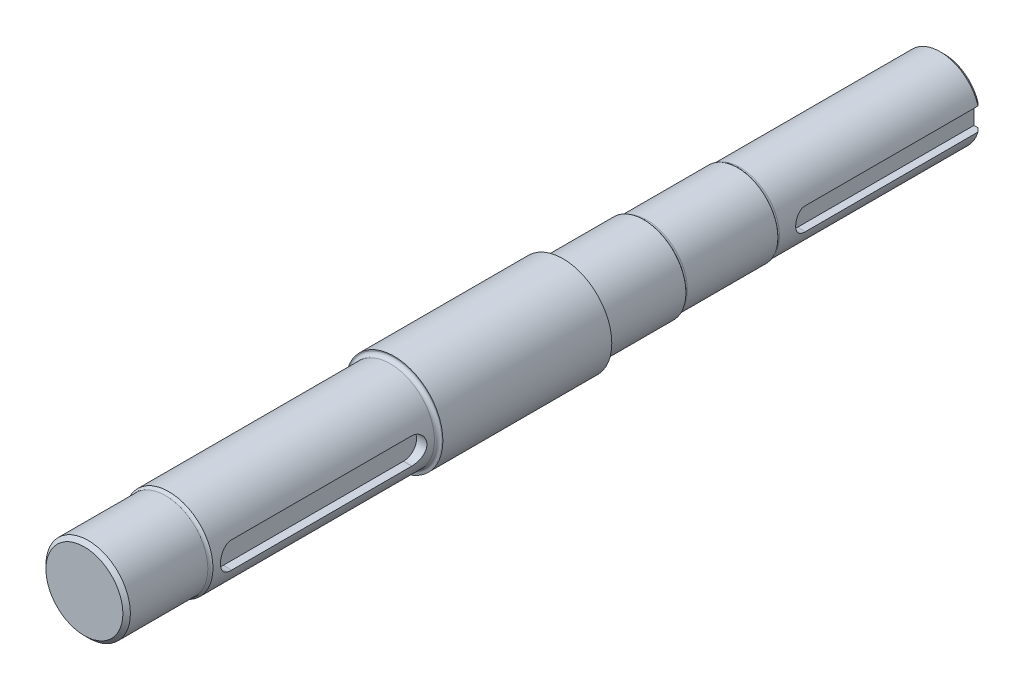
ISO-10303-21;
HEADER;
FILE_DESCRIPTION(('STEP AP214'),'2;1');
FILE_NAME('part.step','',(''),(''),'','','');
FILE_SCHEMA(('AUTOMOTIVE_DESIGN { 1 0 10303 214 1 1 1 1 }'));
ENDSEC;
DATA;
#1=APPLICATION_CONTEXT('core data for automotive mechanical design processes');
#2=APPLICATION_PROTOCOL_DEFINITION('international standard','automotive_design',2000,#1);
#3=PRODUCT_CONTEXT('',#1,'mechanical');
#4=PRODUCT('Part','Part','',(#3));
#5=PRODUCT_RELATED_PRODUCT_CATEGORY('part','',(#4));
#6=PRODUCT_DEFINITION_FORMATION('','',#4);
#7=PRODUCT_DEFINITION_CONTEXT('part definition',#1,'design');
#8=PRODUCT_DEFINITION('design','',#6,#7);
#9=PRODUCT_DEFINITION_SHAPE('','',#8);
#10=(LENGTH_UNIT() NAMED_UNIT(*) SI_UNIT(.MILLI.,.METRE.));
#11=(NAMED_UNIT(*) PLANE_ANGLE_UNIT() SI_UNIT($,.RADIAN.));
#12=(NAMED_UNIT(*) SI_UNIT($,.STERADIAN.) SOLID_ANGLE_UNIT());
#13=UNCERTAINTY_MEASURE_WITH_UNIT(LENGTH_MEASURE(1.E-05),#10,'distance_accuracy_value','');
#14=(GEOMETRIC_REPRESENTATION_CONTEXT(3) GLOBAL_UNCERTAINTY_ASSIGNED_CONTEXT((#13)) GLOBAL_UNIT_ASSIGNED_CONTEXT((#10,
#11,#12)) REPRESENTATION_CONTEXT('',''));
#15=CARTESIAN_POINT('',(0.,0.,0.));
#16=DIRECTION('',(0.,0.,1.));
#17=DIRECTION('',(1.,0.,0.));
#18=AXIS2_PLACEMENT_3D('',#15,#16,#17);
#19=CARTESIAN_POINT('',(0.,-21.,-293.));
#20=DIRECTION('',(0.,0.,-1.));
#21=DIRECTION('',(-1.,0.,0.));
#22=AXIS2_PLACEMENT_3D('',#19,#20,#21);
#23=PLANE('',#22);
#24=DIRECTION('',(0.,1.,0.));
#25=VECTOR('',#24,1.);
#26=CARTESIAN_POINT('',(16.,6.,-293.));
#27=LINE('',#26,#25);
#28=CARTESIAN_POINT('',(16.,-6.,-293.));
#29=VERTEX_POINT('',#28);
#30=CARTESIAN_POINT('',(16.,6.,-293.));
#31=VERTEX_POINT('',#30);
#32=EDGE_CURVE('E129',#29,#31,#27,.T.);
#33=ORIENTED_EDGE('',*,*,#32,.F.);
#34=DIRECTION('',(-1.,0.,0.));
#35=VECTOR('',#34,1.);
#36=CARTESIAN_POINT('',(63.,-6.,-293.));
#37=LINE('',#36,#35);
#38=CARTESIAN_POINT('',(18.0277563773198,-6.,-293.));
#39=VERTEX_POINT('',#38);
#40=EDGE_CURVE('E121',#39,#29,#37,.T.);
#41=ORIENTED_EDGE('',*,*,#40,.F.);
#42=CARTESIAN_POINT('',(0.,0.,-293.));
#43=DIRECTION('',(0.,0.,-1.));
#44=DIRECTION('',(-1.,0.,0.));
#45=AXIS2_PLACEMENT_3D('',#42,#43,#44);
#46=CIRCLE('',#45,18.9999999999999);
#47=CARTESIAN_POINT('',(18.0277563773198,6.,-293.));
#48=VERTEX_POINT('',#47);
#49=EDGE_CURVE('E210',#39,#48,#46,.T.);
#50=ORIENTED_EDGE('',*,*,#49,.T.);
#51=DIRECTION('',(-1.,0.,0.));
#52=VECTOR('',#51,1.);
#53=CARTESIAN_POINT('',(63.,6.,-293.));
#54=LINE('',#53,#52);
#55=EDGE_CURVE('E55',#48,#31,#54,.T.);
#56=ORIENTED_EDGE('',*,*,#55,.T.);
#57=EDGE_LOOP('',(#33,#41,#50,#56));
#58=FACE_BOUND('',#57,.T.);
#59=ADVANCED_FACE('F35',(#58),#23,.T.);
#60=CARTESIAN_POINT('',(0.,0.,440.995541917554));
#61=DIRECTION('',(0.,0.,1.));
#62=DIRECTION('',(1.,0.,0.));
#63=AXIS2_PLACEMENT_3D('',#60,#61,#62);
#64=CYLINDRICAL_SURFACE('',#63,21.);
#65=CARTESIAN_POINT('',(0.,0.,-184.322875655532));
#66=DIRECTION('',(0.,0.,1.));
#67=DIRECTION('',(1.,0.,0.));
#68=AXIS2_PLACEMENT_3D('',#65,#66,#67);
#69=CIRCLE('',#68,21.);
#70=CARTESIAN_POINT('',(21.,0.,-184.322875655532));
#71=VERTEX_POINT('',#70);
#72=EDGE_CURVE('E192',#71,#71,#69,.F.);
#73=ORIENTED_EDGE('',*,*,#72,.T.);
#74=EDGE_LOOP('',(#73));
#75=FACE_BOUND('',#74,.T.);
#76=CARTESIAN_POINT('',(0.,0.,-291.));
#77=DIRECTION('',(0.,0.,-1.));
#78=DIRECTION('',(-1.,0.,0.));
#79=AXIS2_PLACEMENT_3D('',#76,#77,#78);
#80=CIRCLE('',#79,21.);
#81=CARTESIAN_POINT('',(20.1246117974981,6.,-291.));
#82=VERTEX_POINT('',#81);
#83=CARTESIAN_POINT('',(20.1246117974981,-6.,-291.));
#84=VERTEX_POINT('',#83);
#85=EDGE_CURVE('E207',#82,#84,#80,.F.);
#86=ORIENTED_EDGE('',*,*,#85,.T.);
#87=DIRECTION('',(0.,0.,1.));
#88=VECTOR('',#87,1.);
#89=CARTESIAN_POINT('',(20.1246117974981,-5.99999999999999,440.995541917554));
#90=LINE('',#89,#88);
#91=CARTESIAN_POINT('',(20.1246117974981,-6.,-199.));
#92=VERTEX_POINT('',#91);
#93=EDGE_CURVE('E144',#84,#92,#90,.T.);
#94=ORIENTED_EDGE('',*,*,#93,.T.);
#95=CARTESIAN_POINT('',(20.1246117974981,-6.,-199.));
#96=CARTESIAN_POINT('',(20.1245894844569,-6.00002192169975,-198.834947668688));
#97=CARTESIAN_POINT('',(20.1266415650335,-5.9931904240759,-198.669903348075));
#98=CARTESIAN_POINT('',(20.1347317436705,-5.96598259693693,-198.341066478376));
#99=CARTESIAN_POINT('',(20.1407690151806,-5.94560907610498,-198.177273676843));
#100=CARTESIAN_POINT('',(20.1566481622527,-5.89154299099,-197.852490043676));
#101=CARTESIAN_POINT('',(20.1664810208216,-5.85788198887895,-197.691493509271));
#102=CARTESIAN_POINT('',(20.1896457121068,-5.77753958210296,-197.373039770528));
#103=CARTESIAN_POINT('',(20.2029776228772,-5.73085788698048,-197.21558264523));
#104=CARTESIAN_POINT('',(20.2327374247249,-5.62488729317033,-196.905364453882));
#105=CARTESIAN_POINT('',(20.2491637507907,-5.56560476546174,-196.752601059188));
#106=CARTESIAN_POINT('',(20.2846467474582,-5.43485915630499,-196.452631635706));
#107=CARTESIAN_POINT('',(20.3037043952519,-5.36339154736579,-196.305427697513));
#108=CARTESIAN_POINT('',(20.3439081708857,-5.2088169576332,-196.01756540388));
#109=CARTESIAN_POINT('',(20.3650542979004,-5.12570998143987,-195.876907045853));
#110=CARTESIAN_POINT('',(20.4088630364894,-4.94839867436059,-195.602944581921));
#111=CARTESIAN_POINT('',(20.4315262203764,-4.8541901450833,-195.469643286478));
#112=CARTESIAN_POINT('',(20.4783436926205,-4.65278362553808,-195.207961825265));
#113=CARTESIAN_POINT('',(20.5025212494045,-4.54531610125277,-195.07979320088));
#114=CARTESIAN_POINT('',(20.5511665277305,-4.32005021369054,-194.832853702692));
#115=CARTESIAN_POINT('',(20.5756343537369,-4.2022480271534,-194.714086338014));
#116=CARTESIAN_POINT('',(20.6241797197623,-3.95712206741071,-194.486784178728));
#117=CARTESIAN_POINT('',(20.6482573358332,-3.82980017742366,-194.378247369832));
#118=CARTESIAN_POINT('',(20.6953839164428,-3.56636964243007,-194.172060995003));
#119=CARTESIAN_POINT('',(20.7184324987362,-3.43025777747806,-194.074415454895));
#120=CARTESIAN_POINT('',(20.7632735217347,-3.14758929991082,-193.889054410551));
#121=CARTESIAN_POINT('',(20.7850352899035,-3.00088721837234,-193.801553110419));
#122=CARTESIAN_POINT('',(20.826226420028,-2.7002441525681,-193.639228116655));
#123=CARTESIAN_POINT('',(20.8456549445903,-2.54630059678401,-193.564408970666));
#124=CARTESIAN_POINT('',(20.8816082415408,-2.23235057760216,-193.428116616058));
#125=CARTESIAN_POINT('',(20.898134058101,-2.07234631966332,-193.366638606438));
#126=CARTESIAN_POINT('',(20.9278108104084,-1.74738349510969,-193.257524538967));
#127=CARTESIAN_POINT('',(20.9409618867737,-1.58242513524158,-193.209887904364));
#128=CARTESIAN_POINT('',(20.9632114411614,-1.25311298298007,-193.129934424879));
#129=CARTESIAN_POINT('',(20.9724060858907,-1.08885424992111,-193.097252652378));
#130=CARTESIAN_POINT('',(20.9869654862023,-0.758072191863194,-193.045729901245));
#131=CARTESIAN_POINT('',(20.9923316727767,-0.591549736734751,-193.026883751092));
#132=CARTESIAN_POINT('',(20.9990869856429,-0.257425560637054,-193.003185549667));
#133=CARTESIAN_POINT('',(21.0004759736798,-0.0898238023521121,-192.998333984873));
#134=CARTESIAN_POINT('',(20.999236691677,0.245181542828501,-193.002671725083));
#135=CARTESIAN_POINT('',(20.9966084880238,0.412585132953262,-193.011860798056));
#136=CARTESIAN_POINT('',(20.9875445764644,0.741067651658925,-193.0437217228));
#137=CARTESIAN_POINT('',(20.9812220240654,0.902188755140109,-193.065992978724));
#138=CARTESIAN_POINT('',(20.9650286514685,1.2219709065223,-193.123505519041));
#139=CARTESIAN_POINT('',(20.9551566896347,1.38063114576115,-193.158750976558));
#140=CARTESIAN_POINT('',(20.9321284663263,1.69432288207988,-193.241910347137));
#141=CARTESIAN_POINT('',(20.918972706835,1.84935492983109,-193.289822323978));
#142=CARTESIAN_POINT('',(20.8897205698511,2.15478873602949,-193.397935037923));
#143=CARTESIAN_POINT('',(20.8736241040379,2.30519035524902,-193.458136144122));
#144=CARTESIAN_POINT('',(20.8387145142278,2.60202980978099,-193.591101623643));
#145=CARTESIAN_POINT('',(20.8198732783987,2.74840530116376,-193.663997747168));
#146=CARTESIAN_POINT('',(20.7801082571492,3.0344604453685,-193.821323762295));
#147=CARTESIAN_POINT('',(20.7591851160121,3.17414215000025,-193.90575008866));
#148=CARTESIAN_POINT('',(20.7157807359019,3.44606990247429,-194.085614020909));
#149=CARTESIAN_POINT('',(20.6932987274225,3.57831221881557,-194.181057080676));
#150=CARTESIAN_POINT('',(20.6473712971919,3.83444718075925,-194.382259281203));
#151=CARTESIAN_POINT('',(20.6239261924859,3.95834253922789,-194.488015042589));
#152=CARTESIAN_POINT('',(20.5758300072593,4.20132091996745,-194.71312563803));
#153=CARTESIAN_POINT('',(20.551165615785,4.32007832115665,-194.83282935202));
#154=CARTESIAN_POINT('',(20.5021333353903,4.54708837545201,-195.081791573542));
#155=CARTESIAN_POINT('',(20.4777653468064,4.65534464996527,-195.211046759876));
#156=CARTESIAN_POINT('',(20.4299846752419,4.86074636422664,-195.47841209587));
#157=CARTESIAN_POINT('',(20.406572642352,4.95788432140758,-195.616528112395));
#158=CARTESIAN_POINT('',(20.3614014610979,5.14024855061122,-195.900593475688));
#159=CARTESIAN_POINT('',(20.3396416713267,5.22547945590107,-196.046539744782));
#160=CARTESIAN_POINT('',(20.2982196174412,5.38414968403492,-196.34669899954));
#161=CARTESIAN_POINT('',(20.2785778839985,5.45747656574094,-196.500974315305));
#162=CARTESIAN_POINT('',(20.242230137917,5.59078652189583,-196.815449833668));
#163=CARTESIAN_POINT('',(20.2255229337991,5.65077501464742,-196.975647599499));
#164=CARTESIAN_POINT('',(20.1955798271004,5.7568738046708,-197.300705203452));
#165=CARTESIAN_POINT('',(20.1823402998656,5.80299860073584,-197.465559972388));
#166=CARTESIAN_POINT('',(20.1597438752569,5.88101802101864,-197.798794657505));
#167=CARTESIAN_POINT('',(20.1503851792111,5.91291923804017,-197.967172902543));
#168=CARTESIAN_POINT('',(20.136996182678,5.95834488604588,-198.279598136448));
#169=CARTESIAN_POINT('',(20.1323602730056,5.97396720737165,-198.423317955371));
#170=CARTESIAN_POINT('',(20.1261641867038,5.99479248698429,-198.711354754082));
#171=CARTESIAN_POINT('',(20.1245993190641,6.00001133674436,-198.855670485138));
#172=CARTESIAN_POINT('',(20.1246117974981,6.,-199.));
#173=B_SPLINE_CURVE_WITH_KNOTS('',3,(#95,#96,#97,#98,#99,#100,#101,#102,#103,#104,#105,#106,
#107,#108,#109,#110,#111,#112,#113,#114,#115,#116,#117,#118,#119,#120,#121,#122,#123,#124,#125,
#126,#127,#128,#129,#130,#131,#132,#133,#134,#135,#136,#137,#138,#139,#140,#141,#142,#143,#144,
#145,#146,#147,#148,#149,#150,#151,#152,#153,#154,#155,#156,#157,#158,#159,#160,#161,#162,#163,
#164,#165,#166,#167,#168,#169,#170,#171,#172),.UNSPECIFIED.,.F.,.F.,(4,2,2,2,2,2,2,2,2,2,2,2,2,
2,2,2,2,2,2,2,2,2,2,2,2,2,2,2,2,2,2,2,2,2,2,2,2,2,4),(0.,0.49499061456547,0.989878597629598,
1.48359806377504,1.97732854438847,2.47080998622047,2.96447518729514,3.45814019326605,
3.95199249653474,4.4584116134109,4.9650188741466,5.47152618001261,5.97822009394079,
6.49417839820205,7.01032132824592,7.52627820764116,8.04221358474347,8.54478221320034,
9.04716289419293,9.54956103869483,10.0519508808723,10.5397044924402,11.027615126156,
11.5154512202231,12.0033019682409,12.4965554906444,12.9896568387743,13.4830033544228,
13.9761887449054,14.4868330315598,14.997300587207,15.5081096895234,16.0187194690592,
16.5339022452487,17.0488753606756,17.5633080229981,18.077501990939,18.5110248049339,
18.9438848967365),.UNSPECIFIED.);
#174=CARTESIAN_POINT('',(20.1246117974981,6.,-199.));
#175=VERTEX_POINT('',#174);
#176=EDGE_CURVE('E11',#92,#175,#173,.T.);
#177=ORIENTED_EDGE('',*,*,#176,.T.);
#178=DIRECTION('',(0.,0.,1.));
#179=VECTOR('',#178,1.);
#180=CARTESIAN_POINT('',(20.1246117974981,5.99999999999999,440.995541917554));
#181=LINE('',#180,#179);
#182=EDGE_CURVE('E120',#175,#82,#181,.F.);
#183=ORIENTED_EDGE('',*,*,#182,.T.);
#184=EDGE_LOOP('',(#86,#94,#177,#183));
#185=FACE_BOUND('',#184,.T.);
#186=ADVANCED_FACE('F287',(#75,#185),#64,.T.);
#187=CARTESIAN_POINT('',(0.,0.,-291.));
#188=DIRECTION('',(0.,0.,1.));
#189=DIRECTION('',(1.,0.,0.));
#190=AXIS2_PLACEMENT_3D('',#187,#188,#189);
#191=CONICAL_SURFACE('',#190,21.,0.785398163397444);
#192=ORIENTED_EDGE('',*,*,#49,.F.);
#193=CARTESIAN_POINT('',(10.4810452102635,-6.,-299.92306708226));
#194=CARTESIAN_POINT('',(10.6513032546173,-6.,-299.775303031963));
#195=CARTESIAN_POINT('',(10.821125289128,-6.,-299.627038165242));
#196=CARTESIAN_POINT('',(11.1599841790039,-6.,-299.329615943083));
#197=CARTESIAN_POINT('',(11.3290210395694,-6.,-299.180458593571));
#198=CARTESIAN_POINT('',(11.8350772315583,-6.,-298.731817684987));
#199=CARTESIAN_POINT('',(12.1710525240555,-6.,-298.431156260137));
#200=CARTESIAN_POINT('',(12.8407277429341,-6.,-297.827373841522));
#201=CARTESIAN_POINT('',(13.1744278699347,-6.,-297.524253069915));
#202=CARTESIAN_POINT('',(13.8399909256821,-6.,-296.91599688271));
#203=CARTESIAN_POINT('',(14.1718538383084,-6.,-296.610861449484));
#204=CARTESIAN_POINT('',(15.1650644146574,-6.,-295.693106940347));
#205=CARTESIAN_POINT('',(15.8241470780775,-6.,-295.078037143331));
#206=CARTESIAN_POINT('',(17.1380752900525,-6.,-293.843363920047));
#207=CARTESIAN_POINT('',(17.7929207242817,-6.,-293.223760372406));
#208=CARTESIAN_POINT('',(19.0993736402131,-6.,-291.981376778653));
#209=CARTESIAN_POINT('',(19.7509816622991,-6.,-291.358597300414));
#210=CARTESIAN_POINT('',(21.0518353563754,-6.,-290.110591789658));
#211=CARTESIAN_POINT('',(21.7010810535265,-6.,-289.485365783346));
#212=CARTESIAN_POINT('',(22.9978566697794,-6.,-288.232942009451));
#213=CARTESIAN_POINT('',(23.6453863145053,-6.,-287.605743957931));
#214=CARTESIAN_POINT('',(24.9389995977636,-6.,-286.349850216063));
#215=CARTESIAN_POINT('',(25.5850832274327,-6.,-285.721154516583));
#216=CARTESIAN_POINT('',(26.2306240877244,-6.,-285.091903820012));
#217=B_SPLINE_CURVE_WITH_KNOTS('',3,(#193,#194,#195,#196,#197,#198,#199,#200,#201,#202,#203,
#204,#205,#206,#207,#208,#209,#210,#211,#212,#213,#214,#215,#216),.UNSPECIFIED.,.F.,.F.,(4,2,2,
2,2,2,2,2,2,2,2,4),(0.,0.676309587890267,1.35261469009147,2.70518373594153,4.05763193130941,
5.41009197492979,8.11455401696938,10.8190887269061,13.5231557166413,16.2271938209176,
18.9316409276046,21.6361045655783),.UNSPECIFIED.);
#218=EDGE_CURVE('E48',#39,#84,#217,.T.);
#219=ORIENTED_EDGE('',*,*,#218,.T.);
#220=ORIENTED_EDGE('',*,*,#85,.F.);
#221=CARTESIAN_POINT('',(26.2306240877244,6.,-285.091903820012));
#222=CARTESIAN_POINT('',(25.5850832274327,6.,-285.721154516583));
#223=CARTESIAN_POINT('',(24.9389995977636,6.,-286.349850216062));
#224=CARTESIAN_POINT('',(23.6453863145054,6.,-287.605743957931));
#225=CARTESIAN_POINT('',(22.9978566697794,6.,-288.232942009451));
#226=CARTESIAN_POINT('',(21.7010810535266,6.,-289.485365783346));
#227=CARTESIAN_POINT('',(21.0518353563755,6.,-290.110591789658));
#228=CARTESIAN_POINT('',(19.7509816622991,6.,-291.358597300414));
#229=CARTESIAN_POINT('',(19.0993736402131,6.,-291.981376778653));
#230=CARTESIAN_POINT('',(17.7929207242817,6.,-293.223760372406));
#231=CARTESIAN_POINT('',(17.1380752900524,6.,-293.843363920047));
#232=CARTESIAN_POINT('',(15.8241470780775,6.,-295.078037143331));
#233=CARTESIAN_POINT('',(15.1650644146574,6.,-295.693106940347));
#234=CARTESIAN_POINT('',(14.1718538383084,6.,-296.610861449484));
#235=CARTESIAN_POINT('',(13.8399909256821,6.,-296.91599688271));
#236=CARTESIAN_POINT('',(13.1744278699347,6.,-297.524253069915));
#237=CARTESIAN_POINT('',(12.8407277429341,6.,-297.827373841522));
#238=CARTESIAN_POINT('',(12.1710525240555,6.,-298.431156260137));
#239=CARTESIAN_POINT('',(11.8350772315583,6.,-298.731817684987));
#240=CARTESIAN_POINT('',(11.3290210395694,6.,-299.180458593571));
#241=CARTESIAN_POINT('',(11.1599841790039,6.,-299.329615943083));
#242=CARTESIAN_POINT('',(10.821125289128,6.,-299.627038165242));
#243=CARTESIAN_POINT('',(10.6513032546173,6.,-299.775303031963));
#244=CARTESIAN_POINT('',(10.4810452102635,6.,-299.92306708226));
#245=B_SPLINE_CURVE_WITH_KNOTS('',3,(#221,#222,#223,#224,#225,#226,#227,#228,#229,#230,#231,
#232,#233,#234,#235,#236,#237,#238,#239,#240,#241,#242,#243,#244),.UNSPECIFIED.,.F.,.F.,(4,2,2,
2,2,2,2,2,2,2,2,4),(0.,2.70446363797367,5.40891074466061,8.1129488489369,10.8170158386722,
13.5215505486089,16.2260125906485,17.5784726342689,18.9309208296368,20.2834898754868,
20.959794977688,21.6361045655783),.UNSPECIFIED.);
#246=EDGE_CURVE('E260',#82,#48,#245,.T.);
#247=ORIENTED_EDGE('',*,*,#246,.T.);
#248=EDGE_LOOP('',(#192,#219,#220,#247));
#249=FACE_BOUND('',#248,.T.);
#250=ADVANCED_FACE('F269',(#249),#191,.T.);
#251=CARTESIAN_POINT('',(0.,0.,440.995541917554));
#252=DIRECTION('',(0.,0.,1.));
#253=DIRECTION('',(1.,0.,0.));
#254=AXIS2_PLACEMENT_3D('',#251,#252,#253);
#255=CYLINDRICAL_SURFACE('',#254,23.5);
#256=CARTESIAN_POINT('',(0.,0.,2.));
#257=DIRECTION('',(0.,0.,1.));
#258=DIRECTION('',(1.,0.,0.));
#259=AXIS2_PLACEMENT_3D('',#256,#257,#258);
#260=CIRCLE('',#259,23.5);
#261=CARTESIAN_POINT('',(23.5,0.,2.));
#262=VERTEX_POINT('',#261);
#263=EDGE_CURVE('E198',#262,#262,#260,.T.);
#264=ORIENTED_EDGE('',*,*,#263,.T.);
#265=EDGE_LOOP('',(#264));
#266=FACE_BOUND('',#265,.T.);
#267=CARTESIAN_POINT('',(0.,0.,120.));
#268=DIRECTION('',(0.,0.,1.));
#269=DIRECTION('',(1.,0.,0.));
#270=AXIS2_PLACEMENT_3D('',#267,#268,#269);
#271=CIRCLE('',#270,23.5);
#272=CARTESIAN_POINT('',(23.5,0.,120.));
#273=VERTEX_POINT('',#272);
#274=EDGE_CURVE('E165',#273,#273,#271,.T.);
#275=ORIENTED_EDGE('',*,*,#274,.F.);
#276=EDGE_LOOP('',(#275));
#277=FACE_BOUND('',#276,.T.);
#278=DIRECTION('',(0.,0.,1.));
#279=VECTOR('',#278,1.);
#280=CARTESIAN_POINT('',(22.4332342741746,-7.,440.995541917554));
#281=LINE('',#280,#279);
#282=CARTESIAN_POINT('',(22.4332342741746,-7.00000000000001,13.));
#283=VERTEX_POINT('',#282);
#284=CARTESIAN_POINT('',(22.4332342741746,-7.00000000000001,109.));
#285=VERTEX_POINT('',#284);
#286=EDGE_CURVE('E230',#283,#285,#281,.T.);
#287=ORIENTED_EDGE('',*,*,#286,.T.);
#288=CARTESIAN_POINT('',(22.4332342741746,-7.00000000000001,109.));
#289=CARTESIAN_POINT('',(22.4332069307169,-7.00002595583491,109.192180901223));
#290=CARTESIAN_POINT('',(22.4357029157213,-6.99208685935786,109.384351871376));
#291=CARTESIAN_POINT('',(22.4455419129914,-6.960470708831,109.767228500087));
#292=CARTESIAN_POINT('',(22.4528838484605,-6.93679715105623,109.957934474652));
#293=CARTESIAN_POINT('',(22.4721910804064,-6.87398280412955,110.336048332734));
#294=CARTESIAN_POINT('',(22.4841447548678,-6.83488089030004,110.52346327848));
#295=CARTESIAN_POINT('',(22.5123016503537,-6.74156234527354,110.894165880903));
#296=CARTESIAN_POINT('',(22.5285049800091,-6.68734532769801,111.077453431944));
#297=CARTESIAN_POINT('',(22.5646679867444,-6.56428671526882,111.438545705117));
#298=CARTESIAN_POINT('',(22.584625494707,-6.49545356249194,111.616353524668));
#299=CARTESIAN_POINT('',(22.6277307745088,-6.34366013699294,111.965506328238));
#300=CARTESIAN_POINT('',(22.6508797324378,-6.26069460931631,112.136848879171));
#301=CARTESIAN_POINT('',(22.6997112454859,-6.0812622028188,112.471940877477));
#302=CARTESIAN_POINT('',(22.7253939215543,-5.98479467937594,112.635689961822));
#303=CARTESIAN_POINT('',(22.7785991977061,-5.77898915929827,112.954658502078));
#304=CARTESIAN_POINT('',(22.8061224913256,-5.66964629935674,113.109874702244));
#305=CARTESIAN_POINT('',(22.8630462736462,-5.43562429231585,113.414970908873));
#306=CARTESIAN_POINT('',(22.892477655436,-5.31060388109982,113.564583485876));
#307=CARTESIAN_POINT('',(22.9516993255514,-5.04851948611336,113.852877056556));
#308=CARTESIAN_POINT('',(22.9814897352823,-4.91145132384677,113.991554225639));
#309=CARTESIAN_POINT('',(23.0406106861988,-4.62617274325894,114.257042124962));
#310=CARTESIAN_POINT('',(23.0699412248646,-4.47796226391248,114.383852790201));
#311=CARTESIAN_POINT('',(23.1273509031384,-4.1713267266614,114.624771100075));
#312=CARTESIAN_POINT('',(23.1554300525212,-4.0129017485676,114.738878843946));
#313=CARTESIAN_POINT('',(23.2101386876629,-3.68346406440145,114.955819500616));
#314=CARTESIAN_POINT('',(23.2367263407173,-3.5122591549721,115.058371398386));
#315=CARTESIAN_POINT('',(23.2870476552339,-3.16145444263298,115.248600074047));
#316=CARTESIAN_POINT('',(23.3107823701648,-2.98185777267424,115.336282347601));
#317=CARTESIAN_POINT('',(23.3547345238232,-2.61542130553665,115.496116762576));
#318=CARTESIAN_POINT('',(23.3749513065937,-2.42858016547201,115.568266008288));
#319=CARTESIAN_POINT('',(23.4112670053948,-2.04911746571587,115.696357014385));
#320=CARTESIAN_POINT('',(23.4273676966473,-1.85649843814554,115.75230576324));
#321=CARTESIAN_POINT('',(23.4546036771131,-1.47228355882099,115.846195680222));
#322=CARTESIAN_POINT('',(23.465864702882,-1.2808084638225,115.884594738055));
#323=CARTESIAN_POINT('',(23.4837367252216,-0.895179990168475,115.945266948019));
#324=CARTESIAN_POINT('',(23.4903495749751,-0.701027710395682,115.967546526936));
#325=CARTESIAN_POINT('',(23.4987441654192,-0.311429429331251,115.995795857339));
#326=CARTESIAN_POINT('',(23.5005257484417,-0.11598338602635,116.001765076538));
#327=CARTESIAN_POINT('',(23.499206245869,0.274704723791265,115.997335163728));
#328=CARTESIAN_POINT('',(23.4961052485049,0.469946793926098,115.9869363275));
#329=CARTESIAN_POINT('',(23.4852840759977,0.85258657104605,115.950457382846));
#330=CARTESIAN_POINT('',(23.477713121668,1.04003705103875,115.924883723493));
#331=CARTESIAN_POINT('',(23.4582753538161,1.41210198122514,115.858693974996));
#332=CARTESIAN_POINT('',(23.4464070764297,1.59671544263482,115.81807275986));
#333=CARTESIAN_POINT('',(23.4186929104574,1.96171163041693,115.722148684776));
#334=CARTESIAN_POINT('',(23.4028483586021,2.14209575635452,115.666850758436));
#335=CARTESIAN_POINT('',(23.3675856782696,2.49757018102708,115.541990977143));
#336=CARTESIAN_POINT('',(23.3481662067794,2.67265846135981,115.472423760428));
#337=CARTESIAN_POINT('',(23.3060217773072,3.01827708124261,115.318716027743));
#338=CARTESIAN_POINT('',(23.28326230223,3.18873461064117,115.234421327339));
#339=CARTESIAN_POINT('',(23.2351843297898,3.52201221452817,115.052395878672));
#340=CARTESIAN_POINT('',(23.2098649548458,3.68482964165056,114.954660518537));
#341=CARTESIAN_POINT('',(23.1573220866069,4.0017798775566,114.746451996927));
#342=CARTESIAN_POINT('',(23.1300985762022,4.15591260828072,114.635978720989));
#343=CARTESIAN_POINT('',(23.0744401369077,4.45458112384268,114.403015693776));
#344=CARTESIAN_POINT('',(23.0460051732359,4.59911663282995,114.280525597355));
#345=CARTESIAN_POINT('',(22.9875527117181,4.88305495655134,114.019400320763));
#346=CARTESIAN_POINT('',(22.9575162204135,5.02205172724791,113.880327534554));
#347=CARTESIAN_POINT('',(22.8977564416525,5.28784493023422,113.590999242367));
#348=CARTESIAN_POINT('',(22.8680330564681,5.41464527623986,113.44074735129));
#349=CARTESIAN_POINT('',(22.8097016890583,5.65533885267336,113.129868227673));
#350=CARTESIAN_POINT('',(22.7810944610193,5.7692234517333,112.969234168153));
#351=CARTESIAN_POINT('',(22.7258465233781,5.98315172281196,112.638766736357));
#352=CARTESIAN_POINT('',(22.6992050514635,6.08320077349977,112.468936974908));
#353=CARTESIAN_POINT('',(22.6483991436546,6.26972579754376,112.119326014389));
#354=CARTESIAN_POINT('',(22.6242630822926,6.356051174883,111.939460258847));
#355=CARTESIAN_POINT('',(22.5795424919012,6.51313534230193,111.572711581192));
#356=CARTESIAN_POINT('',(22.5589565127143,6.58390049177531,111.385831562471));
#357=CARTESIAN_POINT('',(22.5220018682464,6.70922522952223,111.006526415271));
#358=CARTESIAN_POINT('',(22.5056287693478,6.76380186384378,110.814107355222));
#359=CARTESIAN_POINT('',(22.4776144823811,6.85632392746287,110.425055104358));
#360=CARTESIAN_POINT('',(22.4659711104743,6.89427703291398,110.22842390265));
#361=CARTESIAN_POINT('',(22.4490644795625,6.94911799834859,109.859922179051));
#362=CARTESIAN_POINT('',(22.4431397743727,6.96819920411491,109.688404968865));
#363=CARTESIAN_POINT('',(22.4352190642659,6.99363836770037,109.344596250516));
#364=CARTESIAN_POINT('',(22.4332172477383,7.00001514687833,109.17230626732));
#365=CARTESIAN_POINT('',(22.4332342741746,7.00000000000001,109.));
#366=B_SPLINE_CURVE_WITH_KNOTS('',3,(#288,#289,#290,#291,#292,#293,#294,#295,#296,#297,#298,
#299,#300,#301,#302,#303,#304,#305,#306,#307,#308,#309,#310,#311,#312,#313,#314,#315,#316,#317,
#318,#319,#320,#321,#322,#323,#324,#325,#326,#327,#328,#329,#330,#331,#332,#333,#334,#335,#336,
#337,#338,#339,#340,#341,#342,#343,#344,#345,#346,#347,#348,#349,#350,#351,#352,#353,#354,#355,
#356,#357,#358,#359,#360,#361,#362,#363,#364,#365),.UNSPECIFIED.,.F.,.F.,(4,2,2,2,2,2,2,2,2,2,2,
2,2,2,2,2,2,2,2,2,2,2,2,2,2,2,2,2,2,2,2,2,2,2,2,2,2,2,4),(0.,0.57634728968532,1.15256655495234,
1.72734308025646,2.30213429958349,2.87659442616102,3.45126862701905,4.02597027375092,
4.60088969890842,5.19175588019153,5.78282780513534,6.37390296754926,6.96497351216596,
7.56823234490842,8.17126773101666,8.7744154394728,9.37730257686589,9.9634084693355,
10.5492805543014,11.135171758947,11.7210523763143,12.288399909978,12.8559408901842,
13.423291331361,13.9908553493059,14.5647625670998,15.1388672023383,15.7129769969046,
16.2871032858294,16.8831279279753,17.4789606689537,18.0751892769766,18.6711854412792,
19.2733271937836,19.8752223944156,20.4764815480634,21.0774627681914,21.5949893745609,
22.1117487035884),.UNSPECIFIED.);
#367=CARTESIAN_POINT('',(22.4332342741746,7.00000000000001,109.));
#368=VERTEX_POINT('',#367);
#369=EDGE_CURVE('E254',#285,#368,#366,.T.);
#370=ORIENTED_EDGE('',*,*,#369,.T.);
#371=DIRECTION('',(0.,0.,1.));
#372=VECTOR('',#371,1.);
#373=CARTESIAN_POINT('',(22.4332342741746,7.,440.995541917554));
#374=LINE('',#373,#372);
#375=CARTESIAN_POINT('',(22.4332342741746,7.,13.));
#376=VERTEX_POINT('',#375);
#377=EDGE_CURVE('E219',#368,#376,#374,.F.);
#378=ORIENTED_EDGE('',*,*,#377,.T.);
#379=CARTESIAN_POINT('',(22.4332342741746,7.00000000000001,13.));
#380=CARTESIAN_POINT('',(22.4332069307169,7.00002595583491,12.8078190987771));
#381=CARTESIAN_POINT('',(22.4357029157213,6.99208685935786,12.6156481286236));
#382=CARTESIAN_POINT('',(22.4455419129914,6.960470708831,12.2327714999132));
#383=CARTESIAN_POINT('',(22.4528838484605,6.93679715105623,12.0420655253477));
#384=CARTESIAN_POINT('',(22.4721910804064,6.87398280412955,11.6639516672663));
#385=CARTESIAN_POINT('',(22.4841447548678,6.83488089030004,11.4765367215198));
#386=CARTESIAN_POINT('',(22.5123016503537,6.74156234527354,11.1058341190968));
#387=CARTESIAN_POINT('',(22.5285049800091,6.68734532769801,10.922546568056));
#388=CARTESIAN_POINT('',(22.5646679867444,6.56428671526882,10.561454294883));
#389=CARTESIAN_POINT('',(22.584625494707,6.49545356249194,10.3836464753324));
#390=CARTESIAN_POINT('',(22.6277307745088,6.34366013699294,10.034493671762));
#391=CARTESIAN_POINT('',(22.6508797324378,6.2606946093163,9.86315112082938));
#392=CARTESIAN_POINT('',(22.6997112454859,6.0812622028188,9.52805912252264));
#393=CARTESIAN_POINT('',(22.7253939215543,5.98479467937594,9.36431003817847));
#394=CARTESIAN_POINT('',(22.7785991977061,5.77898915929826,9.04534149792197));
#395=CARTESIAN_POINT('',(22.8061224913256,5.66964629935674,8.89012529775549));
#396=CARTESIAN_POINT('',(22.8630462736462,5.43562429231586,8.58502909112725));
#397=CARTESIAN_POINT('',(22.892477655436,5.31060388109983,8.43541651412374));
#398=CARTESIAN_POINT('',(22.9516993255514,5.04851948611337,8.14712294344411));
#399=CARTESIAN_POINT('',(22.9814897352823,4.91145132384678,8.00844577436058));
#400=CARTESIAN_POINT('',(23.0406106861988,4.62617274325895,7.7429578750382));
#401=CARTESIAN_POINT('',(23.0699412248646,4.47796226391249,7.6161472097994));
#402=CARTESIAN_POINT('',(23.1273509031384,4.17132672666141,7.37522889992503));
#403=CARTESIAN_POINT('',(23.1554300525212,4.01290174856761,7.26112115605437));
#404=CARTESIAN_POINT('',(23.2101386876629,3.68346406440145,7.04418049938417));
#405=CARTESIAN_POINT('',(23.2367263407173,3.5122591549721,6.94162860161358));
#406=CARTESIAN_POINT('',(23.2870476552339,3.16145444263299,6.75139992595289));
#407=CARTESIAN_POINT('',(23.3107823701648,2.98185777267424,6.66371765239885));
#408=CARTESIAN_POINT('',(23.3547345238232,2.61542130553665,6.50388323742367));
#409=CARTESIAN_POINT('',(23.3749513065937,2.42858016547201,6.4317339917121));
#410=CARTESIAN_POINT('',(23.4112670053948,2.04911746571587,6.30364298561538));
#411=CARTESIAN_POINT('',(23.4273676966474,1.85649843814554,6.24769423676013));
#412=CARTESIAN_POINT('',(23.4546036771131,1.47228355882099,6.15380431977779));
#413=CARTESIAN_POINT('',(23.465864702882,1.2808084638225,6.1154052619454));
#414=CARTESIAN_POINT('',(23.4837367252216,0.895179990168472,6.05473305198059));
#415=CARTESIAN_POINT('',(23.4903495749751,0.70102771039568,6.03245347306363));
#416=CARTESIAN_POINT('',(23.4987441654192,0.311429429331249,6.0042041426606));
#417=CARTESIAN_POINT('',(23.5005257484417,0.115983386026348,5.99823492346234));
#418=CARTESIAN_POINT('',(23.499206245869,-0.274704723791268,6.00266483627211));
#419=CARTESIAN_POINT('',(23.4961052485049,-0.469946793926101,6.01306367249971));
#420=CARTESIAN_POINT('',(23.4852840759977,-0.852586571046055,6.04954261715371));
#421=CARTESIAN_POINT('',(23.477713121668,-1.04003705103876,6.07511627650715));
#422=CARTESIAN_POINT('',(23.4582753538161,-1.41210198122515,6.14130602500395));
#423=CARTESIAN_POINT('',(23.4464070764297,-1.59671544263482,6.18192724013985));
#424=CARTESIAN_POINT('',(23.4186929104574,-1.96171163041693,6.2778513152238));
#425=CARTESIAN_POINT('',(23.4028483586021,-2.14209575635452,6.33314924156359));
#426=CARTESIAN_POINT('',(23.3675856782696,-2.49757018102708,6.45800902285691));
#427=CARTESIAN_POINT('',(23.3481662067794,-2.67265846135981,6.52757623957204));
#428=CARTESIAN_POINT('',(23.3060217773072,-3.01827708124261,6.68128397225668));
#429=CARTESIAN_POINT('',(23.28326230223,-3.18873461064118,6.76557867266054));
#430=CARTESIAN_POINT('',(23.2351843297897,-3.52201221452818,6.94760412132833));
#431=CARTESIAN_POINT('',(23.2098649548458,-3.68482964165057,7.0453394814629));
#432=CARTESIAN_POINT('',(23.1573220866069,-4.00177987755662,7.25354800307259));
#433=CARTESIAN_POINT('',(23.1300985762022,-4.15591260828073,7.36402127901111));
#434=CARTESIAN_POINT('',(23.0744401369077,-4.45458112384269,7.5969843062241));
#435=CARTESIAN_POINT('',(23.0460051732359,-4.59911663282996,7.71947440264459));
#436=CARTESIAN_POINT('',(22.9875527117181,-4.88305495655135,7.98059967923665));
#437=CARTESIAN_POINT('',(22.9575162204135,-5.02205172724792,8.11967246544576));
#438=CARTESIAN_POINT('',(22.8977564416525,-5.28784493023423,8.40900075763258));
#439=CARTESIAN_POINT('',(22.8680330564681,-5.41464527623986,8.55925264870985));
#440=CARTESIAN_POINT('',(22.8097016890583,-5.65533885267337,8.87013177232733));
#441=CARTESIAN_POINT('',(22.7810944610193,-5.76922345173331,9.0307658318469));
#442=CARTESIAN_POINT('',(22.7258465233781,-5.98315172281197,9.36123326364317));
#443=CARTESIAN_POINT('',(22.6992050514635,-6.08320077349977,9.53106302509162));
#444=CARTESIAN_POINT('',(22.6483991436546,-6.26972579754377,9.88067398561137));
#445=CARTESIAN_POINT('',(22.6242630822926,-6.35605117488301,10.0605397411532));
#446=CARTESIAN_POINT('',(22.5795424919012,-6.51313534230194,10.427288418808));
#447=CARTESIAN_POINT('',(22.5589565127143,-6.58390049177532,10.6141684375291));
#448=CARTESIAN_POINT('',(22.5220018682464,-6.70922522952224,10.9934735847293));
#449=CARTESIAN_POINT('',(22.5056287693478,-6.76380186384378,11.1858926447778));
#450=CARTESIAN_POINT('',(22.4776144823811,-6.85632392746288,11.5749448956422));
#451=CARTESIAN_POINT('',(22.4659711104743,-6.89427703291398,11.7715760973501));
#452=CARTESIAN_POINT('',(22.4490644795625,-6.94911799834859,12.1400778209489));
#453=CARTESIAN_POINT('',(22.4431397743727,-6.96819920411491,12.3115950311348));
#454=CARTESIAN_POINT('',(22.4352190642659,-6.99363836770037,12.6554037494843));
#455=CARTESIAN_POINT('',(22.4332172477383,-7.00001514687833,12.82769373268));
#456=CARTESIAN_POINT('',(22.4332342741746,-7.00000000000001,13.));
#457=B_SPLINE_CURVE_WITH_KNOTS('',3,(#379,#380,#381,#382,#383,#384,#385,#386,#387,#388,#389,
#390,#391,#392,#393,#394,#395,#396,#397,#398,#399,#400,#401,#402,#403,#404,#405,#406,#407,#408,
#409,#410,#411,#412,#413,#414,#415,#416,#417,#418,#419,#420,#421,#422,#423,#424,#425,#426,#427,
#428,#429,#430,#431,#432,#433,#434,#435,#436,#437,#438,#439,#440,#441,#442,#443,#444,#445,#446,
#447,#448,#449,#450,#451,#452,#453,#454,#455,#456),.UNSPECIFIED.,.F.,.F.,(4,2,2,2,2,2,2,2,2,2,2,
2,2,2,2,2,2,2,2,2,2,2,2,2,2,2,2,2,2,2,2,2,2,2,2,2,2,2,4),(0.,0.576347289685333,1.15256655495234,
1.72734308025647,2.30213429958349,2.87659442616104,3.45126862701907,4.02597027375093,
4.60088969890842,5.19175588019152,5.78282780513533,6.37390296754925,6.96497351216595,
7.56823234490842,8.17126773101666,8.77441543947281,9.37730257686589,9.96340846933551,
10.5492805543014,11.135171758947,11.7210523763143,12.288399909978,12.8559408901842,
13.423291331361,13.9908553493059,14.5647625670998,15.1388672023384,15.7129769969046,
16.2871032858294,16.8831279279754,17.4789606689537,18.0751892769767,18.6711854412792,
19.2733271937836,19.8752223944157,20.4764815480634,21.0774627681914,21.5949893745609,
22.1117487035884),.UNSPECIFIED.);
#458=EDGE_CURVE('E222',#376,#283,#457,.T.);
#459=ORIENTED_EDGE('',*,*,#458,.T.);
#460=EDGE_LOOP('',(#287,#370,#378,#459));
#461=FACE_BOUND('',#460,.T.);
#462=ADVANCED_FACE('F232',(#266,#277,#461),#255,.T.);
#463=CARTESIAN_POINT('',(0.,0.,440.995541917554));
#464=DIRECTION('',(0.,0.,1.));
#465=DIRECTION('',(1.,0.,0.));
#466=AXIS2_PLACEMENT_3D('',#463,#464,#465);
#467=CYLINDRICAL_SURFACE('',#466,21.5);
#468=CARTESIAN_POINT('',(0.,0.,-134.732050807569));
#469=DIRECTION('',(0.,0.,1.));
#470=DIRECTION('',(1.,0.,0.));
#471=AXIS2_PLACEMENT_3D('',#468,#469,#470);
#472=CIRCLE('',#471,21.5);
#473=CARTESIAN_POINT('',(21.5,0.,-134.732050807569));
#474=VERTEX_POINT('',#473);
#475=EDGE_CURVE('E195',#474,#474,#472,.F.);
#476=ORIENTED_EDGE('',*,*,#475,.T.);
#477=EDGE_LOOP('',(#476));
#478=FACE_BOUND('',#477,.T.);
#479=CARTESIAN_POINT('',(0.,0.,-183.));
#480=DIRECTION('',(0.,0.,1.));
#481=DIRECTION('',(1.,0.,0.));
#482=AXIS2_PLACEMENT_3D('',#479,#480,#481);
#483=CIRCLE('',#482,21.5);
#484=CARTESIAN_POINT('',(21.5,0.,-183.));
#485=VERTEX_POINT('',#484);
#486=EDGE_CURVE('E189',#485,#485,#483,.T.);
#487=ORIENTED_EDGE('',*,*,#486,.T.);
#488=EDGE_LOOP('',(#487));
#489=FACE_BOUND('',#488,.T.);
#490=ADVANCED_FACE('F358',(#478,#489),#467,.T.);
#491=CARTESIAN_POINT('',(0.,0.,440.995541917554));
#492=DIRECTION('',(0.,0.,1.));
#493=DIRECTION('',(1.,0.,0.));
#494=AXIS2_PLACEMENT_3D('',#491,#492,#493);
#495=CYLINDRICAL_SURFACE('',#494,22.5);
#496=CARTESIAN_POINT('',(0.,0.,-133.));
#497=DIRECTION('',(0.,0.,1.));
#498=DIRECTION('',(1.,0.,0.));
#499=AXIS2_PLACEMENT_3D('',#496,#497,#498);
#500=CIRCLE('',#499,22.5);
#501=CARTESIAN_POINT('',(22.5,0.,-133.));
#502=VERTEX_POINT('',#501);
#503=EDGE_CURVE('E186',#502,#502,#500,.T.);
#504=ORIENTED_EDGE('',*,*,#503,.T.);
#505=EDGE_LOOP('',(#504));
#506=FACE_BOUND('',#505,.T.);
#507=CARTESIAN_POINT('',(0.,0.,-92.0000000000001));
#508=DIRECTION('',(0.,0.,1.));
#509=DIRECTION('',(1.,0.,0.));
#510=AXIS2_PLACEMENT_3D('',#507,#508,#509);
#511=CIRCLE('',#510,22.5);
#512=CARTESIAN_POINT('',(22.5,0.,-92.0000000000001));
#513=VERTEX_POINT('',#512);
#514=EDGE_CURVE('E183',#513,#513,#511,.T.);
#515=ORIENTED_EDGE('',*,*,#514,.F.);
#516=EDGE_LOOP('',(#515));
#517=FACE_BOUND('',#516,.T.);
#518=ADVANCED_FACE('F355',(#506,#517),#495,.T.);
#519=CARTESIAN_POINT('',(0.,0.,-91.7000000000001));
#520=DIRECTION('',(0.,0.,-1.));
#521=DIRECTION('',(-1.,0.,0.));
#522=AXIS2_PLACEMENT_3D('',#519,#520,#521);
#523=CONICAL_SURFACE('',#522,22.2,0.785398163397506);
#524=ORIENTED_EDGE('',*,*,#514,.T.);
#525=EDGE_LOOP('',(#524));
#526=FACE_BOUND('',#525,.T.);
#527=CARTESIAN_POINT('',(0.,0.,-91.7000000000001));
#528=DIRECTION('',(0.,0.,1.));
#529=DIRECTION('',(1.,0.,0.));
#530=AXIS2_PLACEMENT_3D('',#527,#528,#529);
#531=CIRCLE('',#530,22.2);
#532=CARTESIAN_POINT('',(22.2,0.,-91.7000000000001));
#533=VERTEX_POINT('',#532);
#534=EDGE_CURVE('E180',#533,#533,#531,.T.);
#535=ORIENTED_EDGE('',*,*,#534,.F.);
#536=EDGE_LOOP('',(#535));
#537=FACE_BOUND('',#536,.T.);
#538=ADVANCED_FACE('F351',(#526,#537),#523,.T.);
#539=CARTESIAN_POINT('',(0.,0.,440.995541917554));
#540=DIRECTION('',(0.,0.,1.));
#541=DIRECTION('',(1.,0.,0.));
#542=AXIS2_PLACEMENT_3D('',#539,#540,#541);
#543=CYLINDRICAL_SURFACE('',#542,22.2);
#544=ORIENTED_EDGE('',*,*,#534,.T.);
#545=EDGE_LOOP('',(#544));
#546=FACE_BOUND('',#545,.T.);
#547=CARTESIAN_POINT('',(0.,0.,-90.8000000000001));
#548=DIRECTION('',(0.,0.,1.));
#549=DIRECTION('',(1.,0.,0.));
#550=AXIS2_PLACEMENT_3D('',#547,#548,#549);
#551=CIRCLE('',#550,22.2);
#552=CARTESIAN_POINT('',(22.2,0.,-90.8000000000001));
#553=VERTEX_POINT('',#552);
#554=EDGE_CURVE('E177',#553,#553,#551,.T.);
#555=ORIENTED_EDGE('',*,*,#554,.F.);
#556=EDGE_LOOP('',(#555));
#557=FACE_BOUND('',#556,.T.);
#558=ADVANCED_FACE('F347',(#546,#557),#543,.T.);
#559=CARTESIAN_POINT('',(0.,0.,-90.8000000000001));
#560=DIRECTION('',(0.,0.,1.));
#561=DIRECTION('',(1.,0.,0.));
#562=AXIS2_PLACEMENT_3D('',#559,#560,#561);
#563=TOROIDAL_SURFACE('',#562,23.,0.79999999999999);
#564=ORIENTED_EDGE('',*,*,#554,.T.);
#565=EDGE_LOOP('',(#564));
#566=FACE_BOUND('',#565,.T.);
#567=CARTESIAN_POINT('',(0.,0.,-90.0000000000001));
#568=DIRECTION('',(0.,0.,1.));
#569=DIRECTION('',(1.,0.,0.));
#570=AXIS2_PLACEMENT_3D('',#567,#568,#569);
#571=CIRCLE('',#570,23.);
#572=CARTESIAN_POINT('',(23.,0.,-90.0000000000001));
#573=VERTEX_POINT('',#572);
#574=EDGE_CURVE('E174',#573,#573,#571,.T.);
#575=ORIENTED_EDGE('',*,*,#574,.F.);
#576=EDGE_LOOP('',(#575));
#577=FACE_BOUND('',#576,.T.);
#578=ADVANCED_FACE('F343',(#566,#577),#563,.F.);
#579=CARTESIAN_POINT('',(0.,-26.,-90.0000000000001));
#580=DIRECTION('',(0.,0.,-1.));
#581=DIRECTION('',(-1.,0.,0.));
#582=AXIS2_PLACEMENT_3D('',#579,#580,#581);
#583=PLANE('',#582);
#584=ORIENTED_EDGE('',*,*,#574,.T.);
#585=EDGE_LOOP('',(#584));
#586=FACE_BOUND('',#585,.T.);
#587=CARTESIAN_POINT('',(0.,0.,-90.0000000000001));
#588=DIRECTION('',(0.,0.,1.));
#589=DIRECTION('',(1.,0.,0.));
#590=AXIS2_PLACEMENT_3D('',#587,#588,#589);
#591=CIRCLE('',#590,26.);
#592=CARTESIAN_POINT('',(26.,0.,-90.0000000000001));
#593=VERTEX_POINT('',#592);
#594=EDGE_CURVE('E171',#593,#593,#591,.T.);
#595=ORIENTED_EDGE('',*,*,#594,.F.);
#596=EDGE_LOOP('',(#595));
#597=FACE_BOUND('',#596,.T.);
#598=ADVANCED_FACE('F336',(#586,#597),#583,.T.);
#599=CARTESIAN_POINT('',(0.,0.,440.995541917554));
#600=DIRECTION('',(0.,0.,1.));
#601=DIRECTION('',(1.,0.,0.));
#602=AXIS2_PLACEMENT_3D('',#599,#600,#601);
#603=CYLINDRICAL_SURFACE('',#602,26.);
#604=ORIENTED_EDGE('',*,*,#594,.T.);
#605=EDGE_LOOP('',(#604));
#606=FACE_BOUND('',#605,.T.);
#607=CARTESIAN_POINT('',(0.,0.,0.));
#608=DIRECTION('',(0.,0.,1.));
#609=DIRECTION('',(1.,0.,0.));
#610=AXIS2_PLACEMENT_3D('',#607,#608,#609);
#611=CIRCLE('',#610,26.);
#612=CARTESIAN_POINT('',(26.,0.,0.));
#613=VERTEX_POINT('',#612);
#614=EDGE_CURVE('E168',#613,#613,#611,.T.);
#615=ORIENTED_EDGE('',*,*,#614,.F.);
#616=EDGE_LOOP('',(#615));
#617=FACE_BOUND('',#616,.T.);
#618=ADVANCED_FACE('F328',(#606,#617),#603,.T.);
#619=CARTESIAN_POINT('',(0.,-23.5,0.));
#620=DIRECTION('',(0.,0.,1.));
#621=DIRECTION('',(1.,0.,0.));
#622=AXIS2_PLACEMENT_3D('',#619,#620,#621);
#623=PLANE('',#622);
#624=CARTESIAN_POINT('',(0.,0.,0.));
#625=DIRECTION('',(0.,0.,1.));
#626=DIRECTION('',(1.,0.,0.));
#627=AXIS2_PLACEMENT_3D('',#624,#625,#626);
#628=CIRCLE('',#627,25.5);
#629=CARTESIAN_POINT('',(25.5,0.,0.));
#630=VERTEX_POINT('',#629);
#631=EDGE_CURVE('E201',#630,#630,#628,.F.);
#632=ORIENTED_EDGE('',*,*,#631,.T.);
#633=EDGE_LOOP('',(#632));
#634=FACE_BOUND('',#633,.T.);
#635=ORIENTED_EDGE('',*,*,#614,.T.);
#636=EDGE_LOOP('',(#635));
#637=FACE_BOUND('',#636,.T.);
#638=ADVANCED_FACE('F321',(#634,#637),#623,.T.);
#639=CARTESIAN_POINT('',(0.,0.,440.995541917554));
#640=DIRECTION('',(0.,0.,1.));
#641=DIRECTION('',(1.,0.,0.));
#642=AXIS2_PLACEMENT_3D('',#639,#640,#641);
#643=CYLINDRICAL_SURFACE('',#642,22.5);
#644=CARTESIAN_POINT('',(0.,0.,163.));
#645=DIRECTION('',(0.,0.,1.));
#646=DIRECTION('',(1.,0.,0.));
#647=AXIS2_PLACEMENT_3D('',#644,#645,#646);
#648=CIRCLE('',#647,22.5);
#649=CARTESIAN_POINT('',(22.5,0.,163.));
#650=VERTEX_POINT('',#649);
#651=EDGE_CURVE('E216',#650,#650,#648,.F.);
#652=ORIENTED_EDGE('',*,*,#651,.T.);
#653=EDGE_LOOP('',(#652));
#654=FACE_BOUND('',#653,.T.);
#655=CARTESIAN_POINT('',(0.,0.,121.732050807569));
#656=DIRECTION('',(0.,0.,-1.));
#657=DIRECTION('',(-1.,0.,0.));
#658=AXIS2_PLACEMENT_3D('',#655,#656,#657);
#659=CIRCLE('',#658,22.5);
#660=CARTESIAN_POINT('',(-22.5,0.,121.732050807569));
#661=VERTEX_POINT('',#660);
#662=EDGE_CURVE('E204',#661,#661,#659,.F.);
#663=ORIENTED_EDGE('',*,*,#662,.T.);
#664=EDGE_LOOP('',(#663));
#665=FACE_BOUND('',#664,.T.);
#666=ADVANCED_FACE('F319',(#654,#665),#643,.T.);
#667=CARTESIAN_POINT('',(0.,0.,165.));
#668=DIRECTION('',(0.,0.,1.));
#669=DIRECTION('',(1.,0.,0.));
#670=AXIS2_PLACEMENT_3D('',#667,#668,#669);
#671=PLANE('',#670);
#672=CARTESIAN_POINT('',(0.,0.,165.));
#673=DIRECTION('',(0.,0.,1.));
#674=DIRECTION('',(1.,0.,0.));
#675=AXIS2_PLACEMENT_3D('',#672,#673,#674);
#676=CIRCLE('',#675,20.5);
#677=CARTESIAN_POINT('',(20.5,0.,165.));
#678=VERTEX_POINT('',#677);
#679=EDGE_CURVE('E213',#678,#678,#676,.T.);
#680=ORIENTED_EDGE('',*,*,#679,.T.);
#681=EDGE_LOOP('',(#680));
#682=FACE_BOUND('',#681,.T.);
#683=ADVANCED_FACE('F253',(#682),#671,.T.);
#684=CARTESIAN_POINT('',(0.,0.,-184.322875655532));
#685=DIRECTION('',(0.,0.,1.));
#686=DIRECTION('',(1.,0.,0.));
#687=AXIS2_PLACEMENT_3D('',#684,#685,#686);
#688=TOROIDAL_SURFACE('',#687,23.,2.);
#689=ORIENTED_EDGE('',*,*,#72,.F.);
#690=EDGE_LOOP('',(#689));
#691=FACE_BOUND('',#690,.T.);
#692=ORIENTED_EDGE('',*,*,#486,.F.);
#693=EDGE_LOOP('',(#692));
#694=FACE_BOUND('',#693,.T.);
#695=ADVANCED_FACE('F297',(#691,#694),#688,.F.);
#696=CARTESIAN_POINT('',(0.,0.,-134.732050807569));
#697=DIRECTION('',(0.,0.,1.));
#698=DIRECTION('',(1.,0.,0.));
#699=AXIS2_PLACEMENT_3D('',#696,#697,#698);
#700=TOROIDAL_SURFACE('',#699,23.5,2.);
#701=ORIENTED_EDGE('',*,*,#475,.F.);
#702=EDGE_LOOP('',(#701));
#703=FACE_BOUND('',#702,.T.);
#704=ORIENTED_EDGE('',*,*,#503,.F.);
#705=EDGE_LOOP('',(#704));
#706=FACE_BOUND('',#705,.T.);
#707=ADVANCED_FACE('F300',(#703,#706),#700,.F.);
#708=CARTESIAN_POINT('',(0.,0.,2.));
#709=DIRECTION('',(0.,0.,1.));
#710=DIRECTION('',(1.,0.,0.));
#711=AXIS2_PLACEMENT_3D('',#708,#709,#710);
#712=TOROIDAL_SURFACE('',#711,25.5,2.);
#713=ORIENTED_EDGE('',*,*,#631,.F.);
#714=EDGE_LOOP('',(#713));
#715=FACE_BOUND('',#714,.T.);
#716=ORIENTED_EDGE('',*,*,#263,.F.);
#717=EDGE_LOOP('',(#716));
#718=FACE_BOUND('',#717,.T.);
#719=ADVANCED_FACE('F304',(#715,#718),#712,.F.);
#720=CARTESIAN_POINT('',(0.,0.,121.732050807569));
#721=DIRECTION('',(0.,0.,-1.));
#722=DIRECTION('',(-1.,0.,0.));
#723=AXIS2_PLACEMENT_3D('',#720,#721,#722);
#724=TOROIDAL_SURFACE('',#723,24.5,2.);
#725=ORIENTED_EDGE('',*,*,#274,.T.);
#726=EDGE_LOOP('',(#725));
#727=FACE_BOUND('',#726,.T.);
#728=ORIENTED_EDGE('',*,*,#662,.F.);
#729=EDGE_LOOP('',(#728));
#730=FACE_BOUND('',#729,.T.);
#731=ADVANCED_FACE('F307',(#727,#730),#724,.F.);
#732=CARTESIAN_POINT('',(0.,0.,165.));
#733=DIRECTION('',(0.,0.,-1.));
#734=DIRECTION('',(-1.,0.,0.));
#735=AXIS2_PLACEMENT_3D('',#732,#733,#734);
#736=CONICAL_SURFACE('',#735,20.5,0.785398163397456);
#737=ORIENTED_EDGE('',*,*,#651,.F.);
#738=EDGE_LOOP('',(#737));
#739=FACE_BOUND('',#738,.T.);
#740=ORIENTED_EDGE('',*,*,#679,.F.);
#741=EDGE_LOOP('',(#740));
#742=FACE_BOUND('',#741,.T.);
#743=ADVANCED_FACE('F37',(#739,#742),#736,.T.);
#744=CARTESIAN_POINT('',(61.,0.,109.));
#745=DIRECTION('',(-1.,0.,0.));
#746=DIRECTION('',(0.,0.,1.));
#747=AXIS2_PLACEMENT_3D('',#744,#745,#746);
#748=CYLINDRICAL_SURFACE('',#747,7.00000000000001);
#749=DIRECTION('',(-1.,0.,0.));
#750=VECTOR('',#749,1.);
#751=CARTESIAN_POINT('',(61.,-7.00000000000001,109.));
#752=LINE('',#751,#750);
#753=CARTESIAN_POINT('',(18.,-7.00000000000001,109.));
#754=VERTEX_POINT('',#753);
#755=EDGE_CURVE('E163',#285,#754,#752,.T.);
#756=ORIENTED_EDGE('',*,*,#755,.T.);
#757=CARTESIAN_POINT('',(18.,0.,109.));
#758=DIRECTION('',(1.,0.,0.));
#759=DIRECTION('',(0.,0.,-1.));
#760=AXIS2_PLACEMENT_3D('',#757,#758,#759);
#761=CIRCLE('',#760,7.00000000000001);
#762=CARTESIAN_POINT('',(18.,7.00000000000001,109.));
#763=VERTEX_POINT('',#762);
#764=EDGE_CURVE('E146',#763,#754,#761,.T.);
#765=ORIENTED_EDGE('',*,*,#764,.F.);
#766=DIRECTION('',(-1.,0.,0.));
#767=VECTOR('',#766,1.);
#768=CARTESIAN_POINT('',(61.,7.00000000000001,109.));
#769=LINE('',#768,#767);
#770=EDGE_CURVE('E158',#368,#763,#769,.T.);
#771=ORIENTED_EDGE('',*,*,#770,.F.);
#772=ORIENTED_EDGE('',*,*,#369,.F.);
#773=EDGE_LOOP('',(#756,#765,#771,#772));
#774=FACE_BOUND('',#773,.T.);
#775=ADVANCED_FACE('F247',(#774),#748,.F.);
#776=CARTESIAN_POINT('',(61.,-7.00000000000001,109.));
#777=DIRECTION('',(0.,1.,0.));
#778=DIRECTION('',(0.,0.,1.));
#779=AXIS2_PLACEMENT_3D('',#776,#777,#778);
#780=PLANE('',#779);
#781=DIRECTION('',(-1.,0.,0.));
#782=VECTOR('',#781,1.);
#783=CARTESIAN_POINT('',(61.,-7.00000000000001,13.));
#784=LINE('',#783,#782);
#785=CARTESIAN_POINT('',(18.,-7.00000000000001,13.));
#786=VERTEX_POINT('',#785);
#787=EDGE_CURVE('E161',#283,#786,#784,.T.);
#788=ORIENTED_EDGE('',*,*,#787,.T.);
#789=DIRECTION('',(0.,0.,-1.));
#790=VECTOR('',#789,1.);
#791=CARTESIAN_POINT('',(18.,-7.00000000000001,109.));
#792=LINE('',#791,#790);
#793=EDGE_CURVE('E149',#754,#786,#792,.T.);
#794=ORIENTED_EDGE('',*,*,#793,.F.);
#795=ORIENTED_EDGE('',*,*,#755,.F.);
#796=ORIENTED_EDGE('',*,*,#286,.F.);
#797=EDGE_LOOP('',(#788,#794,#795,#796));
#798=FACE_BOUND('',#797,.T.);
#799=ADVANCED_FACE('F242',(#798),#780,.T.);
#800=CARTESIAN_POINT('',(61.,0.,13.));
#801=DIRECTION('',(-1.,0.,0.));
#802=DIRECTION('',(0.,0.,1.));
#803=AXIS2_PLACEMENT_3D('',#800,#801,#802);
#804=CYLINDRICAL_SURFACE('',#803,7.00000000000001);
#805=DIRECTION('',(-1.,0.,0.));
#806=VECTOR('',#805,1.);
#807=CARTESIAN_POINT('',(61.,7.00000000000001,13.));
#808=LINE('',#807,#806);
#809=CARTESIAN_POINT('',(18.,7.00000000000001,13.));
#810=VERTEX_POINT('',#809);
#811=EDGE_CURVE('E63',#376,#810,#808,.T.);
#812=ORIENTED_EDGE('',*,*,#811,.T.);
#813=CARTESIAN_POINT('',(18.,0.,13.));
#814=DIRECTION('',(1.,0.,0.));
#815=DIRECTION('',(0.,0.,-1.));
#816=AXIS2_PLACEMENT_3D('',#813,#814,#815);
#817=CIRCLE('',#816,7.00000000000001);
#818=EDGE_CURVE('E152',#786,#810,#817,.T.);
#819=ORIENTED_EDGE('',*,*,#818,.F.);
#820=ORIENTED_EDGE('',*,*,#787,.F.);
#821=ORIENTED_EDGE('',*,*,#458,.F.);
#822=EDGE_LOOP('',(#812,#819,#820,#821));
#823=FACE_BOUND('',#822,.T.);
#824=ADVANCED_FACE('F236',(#823),#804,.F.);
#825=CARTESIAN_POINT('',(61.,7.00000000000001,109.));
#826=DIRECTION('',(0.,-1.,0.));
#827=DIRECTION('',(0.,0.,-1.));
#828=AXIS2_PLACEMENT_3D('',#825,#826,#827);
#829=PLANE('',#828);
#830=ORIENTED_EDGE('',*,*,#770,.T.);
#831=DIRECTION('',(0.,0.,1.));
#832=VECTOR('',#831,1.);
#833=CARTESIAN_POINT('',(18.,7.00000000000001,109.));
#834=LINE('',#833,#832);
#835=EDGE_CURVE('E155',#810,#763,#834,.T.);
#836=ORIENTED_EDGE('',*,*,#835,.F.);
#837=ORIENTED_EDGE('',*,*,#811,.F.);
#838=ORIENTED_EDGE('',*,*,#377,.F.);
#839=EDGE_LOOP('',(#830,#836,#837,#838));
#840=FACE_BOUND('',#839,.T.);
#841=ADVANCED_FACE('F241',(#840),#829,.T.);
#842=CARTESIAN_POINT('',(18.,0.,109.));
#843=DIRECTION('',(1.,0.,0.));
#844=DIRECTION('',(0.,0.,-1.));
#845=AXIS2_PLACEMENT_3D('',#842,#843,#844);
#846=PLANE('',#845);
#847=ORIENTED_EDGE('',*,*,#764,.T.);
#848=ORIENTED_EDGE('',*,*,#793,.T.);
#849=ORIENTED_EDGE('',*,*,#818,.T.);
#850=ORIENTED_EDGE('',*,*,#835,.T.);
#851=EDGE_LOOP('',(#847,#848,#849,#850));
#852=FACE_BOUND('',#851,.T.);
#853=ADVANCED_FACE('F280',(#852),#846,.T.);
#854=CARTESIAN_POINT('',(63.,0.,-199.));
#855=DIRECTION('',(-1.,0.,0.));
#856=DIRECTION('',(0.,0.,1.));
#857=AXIS2_PLACEMENT_3D('',#854,#855,#856);
#858=CYLINDRICAL_SURFACE('',#857,6.);
#859=DIRECTION('',(-1.,0.,0.));
#860=VECTOR('',#859,1.);
#861=CARTESIAN_POINT('',(63.,-6.,-199.));
#862=LINE('',#861,#860);
#863=CARTESIAN_POINT('',(16.,-6.,-199.));
#864=VERTEX_POINT('',#863);
#865=EDGE_CURVE('E112',#92,#864,#862,.T.);
#866=ORIENTED_EDGE('',*,*,#865,.T.);
#867=CARTESIAN_POINT('',(16.,0.,-199.));
#868=DIRECTION('',(1.,0.,0.));
#869=DIRECTION('',(0.,0.,-1.));
#870=AXIS2_PLACEMENT_3D('',#867,#868,#869);
#871=CIRCLE('',#870,6.);
#872=CARTESIAN_POINT('',(16.,6.,-199.));
#873=VERTEX_POINT('',#872);
#874=EDGE_CURVE('E117',#873,#864,#871,.T.);
#875=ORIENTED_EDGE('',*,*,#874,.F.);
#876=DIRECTION('',(-1.,0.,0.));
#877=VECTOR('',#876,1.);
#878=CARTESIAN_POINT('',(63.,6.,-199.));
#879=LINE('',#878,#877);
#880=EDGE_CURVE('E138',#175,#873,#879,.T.);
#881=ORIENTED_EDGE('',*,*,#880,.F.);
#882=ORIENTED_EDGE('',*,*,#176,.F.);
#883=EDGE_LOOP('',(#866,#875,#881,#882));
#884=FACE_BOUND('',#883,.T.);
#885=ADVANCED_FACE('F114',(#884),#858,.F.);
#886=CARTESIAN_POINT('',(63.,-6.,-199.));
#887=DIRECTION('',(0.,1.,0.));
#888=DIRECTION('',(0.,0.,1.));
#889=AXIS2_PLACEMENT_3D('',#886,#887,#888);
#890=PLANE('',#889);
#891=ORIENTED_EDGE('',*,*,#218,.F.);
#892=ORIENTED_EDGE('',*,*,#40,.T.);
#893=DIRECTION('',(0.,0.,-1.));
#894=VECTOR('',#893,1.);
#895=CARTESIAN_POINT('',(16.,-6.,-199.));
#896=LINE('',#895,#894);
#897=EDGE_CURVE('E124',#864,#29,#896,.T.);
#898=ORIENTED_EDGE('',*,*,#897,.F.);
#899=ORIENTED_EDGE('',*,*,#865,.F.);
#900=ORIENTED_EDGE('',*,*,#93,.F.);
#901=EDGE_LOOP('',(#891,#892,#898,#899,#900));
#902=FACE_BOUND('',#901,.T.);
#903=ADVANCED_FACE('F125',(#902),#890,.T.);
#904=CARTESIAN_POINT('',(63.,6.,-199.));
#905=DIRECTION('',(0.,-1.,0.));
#906=DIRECTION('',(0.,0.,-1.));
#907=AXIS2_PLACEMENT_3D('',#904,#905,#906);
#908=PLANE('',#907);
#909=ORIENTED_EDGE('',*,*,#880,.T.);
#910=DIRECTION('',(0.,0.,1.));
#911=VECTOR('',#910,1.);
#912=CARTESIAN_POINT('',(16.,6.,-199.));
#913=LINE('',#912,#911);
#914=EDGE_CURVE('E133',#31,#873,#913,.T.);
#915=ORIENTED_EDGE('',*,*,#914,.F.);
#916=ORIENTED_EDGE('',*,*,#55,.F.);
#917=ORIENTED_EDGE('',*,*,#246,.F.);
#918=ORIENTED_EDGE('',*,*,#182,.F.);
#919=EDGE_LOOP('',(#909,#915,#916,#917,#918));
#920=FACE_BOUND('',#919,.T.);
#921=ADVANCED_FACE('F272',(#920),#908,.T.);
#922=CARTESIAN_POINT('',(16.,0.,-199.));
#923=DIRECTION('',(1.,0.,0.));
#924=DIRECTION('',(0.,0.,-1.));
#925=AXIS2_PLACEMENT_3D('',#922,#923,#924);
#926=PLANE('',#925);
#927=ORIENTED_EDGE('',*,*,#874,.T.);
#928=ORIENTED_EDGE('',*,*,#897,.T.);
#929=ORIENTED_EDGE('',*,*,#32,.T.);
#930=ORIENTED_EDGE('',*,*,#914,.T.);
#931=EDGE_LOOP('',(#927,#928,#929,#930));
#932=FACE_BOUND('',#931,.T.);
#933=ADVANCED_FACE('F132',(#932),#926,.T.);
#934=CLOSED_SHELL('',(#59,#186,#250,#462,#490,#518,#538,#558,#578,#598,#618,#638,#666,#683,#695,
#707,#719,#731,#743,#775,#799,#824,#841,#853,#885,#903,#921,#933));
#935=MANIFOLD_SOLID_BREP('B2',#934);
#936=ADVANCED_BREP_SHAPE_REPRESENTATION('',(#18,#935),#14);
#937=SHAPE_DEFINITION_REPRESENTATION(#9,#936);
ENDSEC;
END-ISO-10303-21;
